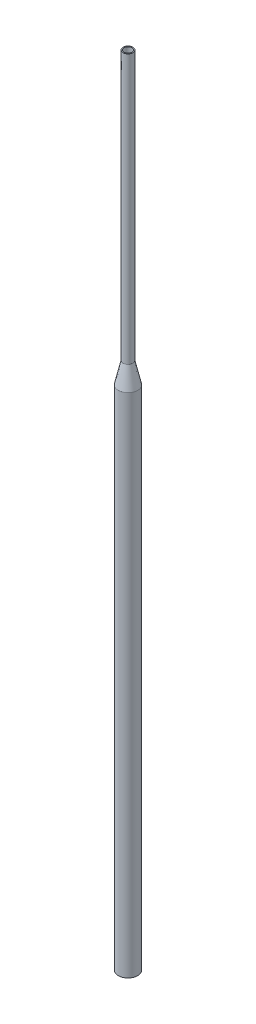
ISO-10303-21;
HEADER;
FILE_DESCRIPTION(('STEP AP214'),'2;1');
FILE_NAME('part.step','',(''),(''),'','','');
FILE_SCHEMA(('AUTOMOTIVE_DESIGN { 1 0 10303 214 1 1 1 1 }'));
ENDSEC;
DATA;
#1=APPLICATION_CONTEXT('core data for automotive mechanical design processes');
#2=APPLICATION_PROTOCOL_DEFINITION('international standard','automotive_design',2000,#1);
#3=PRODUCT_CONTEXT('',#1,'mechanical');
#4=PRODUCT('Part','Part','',(#3));
#5=PRODUCT_RELATED_PRODUCT_CATEGORY('part','',(#4));
#6=PRODUCT_DEFINITION_FORMATION('','',#4);
#7=PRODUCT_DEFINITION_CONTEXT('part definition',#1,'design');
#8=PRODUCT_DEFINITION('design','',#6,#7);
#9=PRODUCT_DEFINITION_SHAPE('','',#8);
#10=(LENGTH_UNIT() NAMED_UNIT(*) SI_UNIT(.MILLI.,.METRE.));
#11=(NAMED_UNIT(*) PLANE_ANGLE_UNIT() SI_UNIT($,.RADIAN.));
#12=(NAMED_UNIT(*) SI_UNIT($,.STERADIAN.) SOLID_ANGLE_UNIT());
#13=UNCERTAINTY_MEASURE_WITH_UNIT(LENGTH_MEASURE(1.E-05),#10,'distance_accuracy_value','');
#14=(GEOMETRIC_REPRESENTATION_CONTEXT(3) GLOBAL_UNCERTAINTY_ASSIGNED_CONTEXT((#13)) GLOBAL_UNIT_ASSIGNED_CONTEXT((#10,
#11,#12)) REPRESENTATION_CONTEXT('',''));
#15=CARTESIAN_POINT('',(0.,0.,0.));
#16=DIRECTION('',(0.,0.,1.));
#17=DIRECTION('',(1.,0.,0.));
#18=AXIS2_PLACEMENT_3D('',#15,#16,#17);
#19=CARTESIAN_POINT('',(0.,820.,0.));
#20=DIRECTION('',(0.,-1.,0.));
#21=DIRECTION('',(0.,0.,-1.));
#22=AXIS2_PLACEMENT_3D('',#19,#20,#21);
#23=CYLINDRICAL_SURFACE('',#22,5.);
#24=CARTESIAN_POINT('',(0.,543.314758742843,0.));
#25=DIRECTION('',(0.,1.,0.));
#26=DIRECTION('',(0.,0.,1.));
#27=AXIS2_PLACEMENT_3D('',#24,#25,#26);
#28=CIRCLE('',#27,5.);
#29=CARTESIAN_POINT('',(0.,543.314758742843,-5.00000000000001));
#30=VERTEX_POINT('',#29);
#31=EDGE_CURVE('E38',#30,#30,#28,.T.);
#32=ORIENTED_EDGE('',*,*,#31,.T.);
#33=EDGE_LOOP('',(#32));
#34=FACE_BOUND('',#33,.T.);
#35=CARTESIAN_POINT('',(0.,820.,0.));
#36=DIRECTION('',(0.,1.,0.));
#37=DIRECTION('',(0.,0.,1.));
#38=AXIS2_PLACEMENT_3D('',#35,#36,#37);
#39=CIRCLE('',#38,5.);
#40=CARTESIAN_POINT('',(0.,820.,5.));
#41=VERTEX_POINT('',#40);
#42=EDGE_CURVE('E42',#41,#41,#39,.T.);
#43=ORIENTED_EDGE('',*,*,#42,.F.);
#44=EDGE_LOOP('',(#43));
#45=FACE_BOUND('',#44,.T.);
#46=ADVANCED_FACE('F31',(#34,#45),#23,.T.);
#47=CARTESIAN_POINT('',(0.,820.,0.));
#48=DIRECTION('',(0.,1.,0.));
#49=DIRECTION('',(0.,0.,1.));
#50=AXIS2_PLACEMENT_3D('',#47,#48,#49);
#51=PLANE('',#50);
#52=CARTESIAN_POINT('',(0.,820.,0.));
#53=DIRECTION('',(0.,1.,0.));
#54=DIRECTION('',(0.,0.,1.));
#55=AXIS2_PLACEMENT_3D('',#52,#53,#54);
#56=CIRCLE('',#55,4.);
#57=CARTESIAN_POINT('',(0.,820.,4.));
#58=VERTEX_POINT('',#57);
#59=EDGE_CURVE('E52',#58,#58,#56,.T.);
#60=ORIENTED_EDGE('',*,*,#59,.F.);
#61=EDGE_LOOP('',(#60));
#62=FACE_BOUND('',#61,.T.);
#63=ORIENTED_EDGE('',*,*,#42,.T.);
#64=EDGE_LOOP('',(#63));
#65=FACE_BOUND('',#64,.T.);
#66=ADVANCED_FACE('F67',(#62,#65),#51,.T.);
#67=CARTESIAN_POINT('',(0.,500.,0.));
#68=DIRECTION('',(0.,-1.,0.));
#69=DIRECTION('',(0.,0.,-1.));
#70=AXIS2_PLACEMENT_3D('',#67,#68,#69);
#71=CYLINDRICAL_SURFACE('',#70,10.);
#72=CARTESIAN_POINT('',(0.,521.657379371422,0.));
#73=DIRECTION('',(0.,-1.,0.));
#74=DIRECTION('',(0.,0.,-1.));
#75=AXIS2_PLACEMENT_3D('',#72,#73,#74);
#76=CIRCLE('',#75,10.);
#77=CARTESIAN_POINT('',(0.,521.657379371422,-9.99999999999998));
#78=VERTEX_POINT('',#77);
#79=EDGE_CURVE('E10',#78,#78,#76,.T.);
#80=ORIENTED_EDGE('',*,*,#79,.T.);
#81=EDGE_LOOP('',(#80));
#82=FACE_BOUND('',#81,.T.);
#83=CARTESIAN_POINT('',(0.,0.,0.));
#84=DIRECTION('',(0.,1.,0.));
#85=DIRECTION('',(0.,0.,1.));
#86=AXIS2_PLACEMENT_3D('',#83,#84,#85);
#87=CIRCLE('',#86,10.);
#88=CARTESIAN_POINT('',(0.,0.,10.));
#89=VERTEX_POINT('',#88);
#90=EDGE_CURVE('E46',#89,#89,#87,.T.);
#91=ORIENTED_EDGE('',*,*,#90,.T.);
#92=EDGE_LOOP('',(#91));
#93=FACE_BOUND('',#92,.T.);
#94=ADVANCED_FACE('F70',(#82,#93),#71,.T.);
#95=CARTESIAN_POINT('',(0.,0.,0.));
#96=DIRECTION('',(0.,1.,0.));
#97=DIRECTION('',(0.,0.,1.));
#98=AXIS2_PLACEMENT_3D('',#95,#96,#97);
#99=PLANE('',#98);
#100=CARTESIAN_POINT('',(0.,0.,0.));
#101=DIRECTION('',(0.,1.,0.));
#102=DIRECTION('',(0.,0.,1.));
#103=AXIS2_PLACEMENT_3D('',#100,#101,#102);
#104=CIRCLE('',#103,4.);
#105=CARTESIAN_POINT('',(0.,0.,4.));
#106=VERTEX_POINT('',#105);
#107=EDGE_CURVE('E51',#106,#106,#104,.T.);
#108=ORIENTED_EDGE('',*,*,#107,.T.);
#109=EDGE_LOOP('',(#108));
#110=FACE_BOUND('',#109,.T.);
#111=ORIENTED_EDGE('',*,*,#90,.F.);
#112=EDGE_LOOP('',(#111));
#113=FACE_BOUND('',#112,.T.);
#114=ADVANCED_FACE('F58',(#110,#113),#99,.F.);
#115=CARTESIAN_POINT('',(0.,543.314758742843,0.));
#116=DIRECTION('',(0.,-1.,0.));
#117=DIRECTION('',(0.,0.,-1.));
#118=AXIS2_PLACEMENT_3D('',#115,#116,#117);
#119=CONICAL_SURFACE('',#118,5.,0.226892802759261);
#120=CARTESIAN_POINT('',(0.,521.657379371422,-9.99999999999998));
#121=CARTESIAN_POINT('',(0.,521.882977073208,-9.94791666666664));
#122=CARTESIAN_POINT('',(0.,522.108574774994,-9.89583333333331));
#123=CARTESIAN_POINT('',(0.,522.559770178565,-9.79166666666665));
#124=CARTESIAN_POINT('',(0.,522.785367880351,-9.73958333333332));
#125=CARTESIAN_POINT('',(0.,523.236563283922,-9.63541666666666));
#126=CARTESIAN_POINT('',(0.,523.462160985707,-9.58333333333332));
#127=CARTESIAN_POINT('',(0.,523.913356389279,-9.47916666666665));
#128=CARTESIAN_POINT('',(0.,524.138954091064,-9.42708333333333));
#129=CARTESIAN_POINT('',(0.,524.590149494636,-9.32291666666666));
#130=CARTESIAN_POINT('',(0.,524.815747196421,-9.27083333333332));
#131=CARTESIAN_POINT('',(0.,525.266942599992,-9.16666666666665));
#132=CARTESIAN_POINT('',(0.,525.492540301778,-9.11458333333333));
#133=CARTESIAN_POINT('',(0.,525.943735705349,-9.01041666666666));
#134=CARTESIAN_POINT('',(0.,526.169333407135,-8.95833333333332));
#135=CARTESIAN_POINT('',(0.,526.620528810706,-8.85416666666665));
#136=CARTESIAN_POINT('',(0.,526.846126512492,-8.80208333333333));
#137=CARTESIAN_POINT('',(0.,527.297321916063,-8.69791666666666));
#138=CARTESIAN_POINT('',(0.,527.522919617849,-8.64583333333332));
#139=CARTESIAN_POINT('',(0.,527.97411502142,-8.54166666666666));
#140=CARTESIAN_POINT('',(0.,528.199712723206,-8.48958333333333));
#141=CARTESIAN_POINT('',(0.,528.650908126777,-8.38541666666666));
#142=CARTESIAN_POINT('',(0.,528.876505828563,-8.33333333333332));
#143=CARTESIAN_POINT('',(0.,529.327701232134,-8.22916666666666));
#144=CARTESIAN_POINT('',(0.,529.55329893392,-8.17708333333333));
#145=CARTESIAN_POINT('',(0.,530.004494337491,-8.07291666666667));
#146=CARTESIAN_POINT('',(0.,530.230092039276,-8.02083333333333));
#147=CARTESIAN_POINT('',(0.,530.681287442848,-7.91666666666666));
#148=CARTESIAN_POINT('',(0.,530.906885144633,-7.86458333333333));
#149=CARTESIAN_POINT('',(0.,531.358080548205,-7.76041666666667));
#150=CARTESIAN_POINT('',(0.,531.58367824999,-7.70833333333333));
#151=CARTESIAN_POINT('',(0.,532.034873653561,-7.60416666666666));
#152=CARTESIAN_POINT('',(0.,532.260471355347,-7.55208333333333));
#153=CARTESIAN_POINT('',(0.,532.711666758918,-7.44791666666667));
#154=CARTESIAN_POINT('',(0.,532.937264460704,-7.39583333333334));
#155=CARTESIAN_POINT('',(0.,533.388459864275,-7.29166666666667));
#156=CARTESIAN_POINT('',(0.,533.614057566061,-7.23958333333333));
#157=CARTESIAN_POINT('',(0.,534.065252969632,-7.13541666666666));
#158=CARTESIAN_POINT('',(0.,534.290850671418,-7.08333333333334));
#159=CARTESIAN_POINT('',(0.,534.742046074989,-6.97916666666667));
#160=CARTESIAN_POINT('',(0.,534.967643776775,-6.92708333333333));
#161=CARTESIAN_POINT('',(0.,535.418839180346,-6.82291666666666));
#162=CARTESIAN_POINT('',(0.,535.644436882132,-6.77083333333334));
#163=CARTESIAN_POINT('',(0.,536.095632285703,-6.66666666666667));
#164=CARTESIAN_POINT('',(0.,536.321229987489,-6.61458333333333));
#165=CARTESIAN_POINT('',(0.,536.77242539106,-6.51041666666667));
#166=CARTESIAN_POINT('',(0.,536.998023092846,-6.45833333333334));
#167=CARTESIAN_POINT('',(0.,537.449218496417,-6.35416666666668));
#168=CARTESIAN_POINT('',(0.,537.674816198202,-6.30208333333333));
#169=CARTESIAN_POINT('',(0.,538.126011601774,-6.19791666666667));
#170=CARTESIAN_POINT('',(0.,538.351609303559,-6.14583333333334));
#171=CARTESIAN_POINT('',(0.,538.802804707131,-6.04166666666668));
#172=CARTESIAN_POINT('',(0.,539.028402408916,-5.98958333333334));
#173=CARTESIAN_POINT('',(0.,539.479597812487,-5.88541666666667));
#174=CARTESIAN_POINT('',(0.,539.705195514273,-5.83333333333334));
#175=CARTESIAN_POINT('',(0.,540.156390917844,-5.72916666666668));
#176=CARTESIAN_POINT('',(0.,540.38198861963,-5.67708333333334));
#177=CARTESIAN_POINT('',(0.,540.833184023201,-5.57291666666667));
#178=CARTESIAN_POINT('',(0.,541.058781724987,-5.52083333333335));
#179=CARTESIAN_POINT('',(0.,541.509977128558,-5.41666666666668));
#180=CARTESIAN_POINT('',(0.,541.735574830344,-5.36458333333334));
#181=CARTESIAN_POINT('',(0.,542.186770233915,-5.26041666666667));
#182=CARTESIAN_POINT('',(0.,542.412367935701,-5.20833333333334));
#183=CARTESIAN_POINT('',(0.,542.863563339272,-5.10416666666668));
#184=CARTESIAN_POINT('',(0.,543.089161041058,-5.05208333333335));
#185=CARTESIAN_POINT('',(0.,543.314758742843,-5.00000000000001));
#186=B_SPLINE_CURVE_WITH_KNOTS('',3,(#120,#121,#122,#123,#124,#125,#126,#127,#128,#129,#130,
#131,#132,#133,#134,#135,#136,#137,#138,#139,#140,#141,#142,#143,#144,#145,#146,#147,#148,#149,
#150,#151,#152,#153,#154,#155,#156,#157,#158,#159,#160,#161,#162,#163,#164,#165,#166,#167,#168,
#169,#170,#171,#172,#173,#174,#175,#176,#177,#178,#179,#180,#181,#182,#183,#184,#185),
.UNSPECIFIED.,.F.,.F.,(4,2,2,2,2,2,2,2,2,2,2,2,2,2,2,2,2,2,2,2,2,2,2,2,2,2,2,2,2,2,2,2,4),(0.,
0.694595544153977,1.38919108830806,2.08378663246204,2.77838217661612,3.4729777207701,
4.16757326492418,4.86216880907816,5.55676435323225,6.25135989738622,6.94595544154031,
7.64055098569428,8.33514652984837,9.02974207400234,9.72433761815643,10.4189331623104,
11.1135287064645,11.8081242506186,12.5027197947725,13.1973153389266,13.8919108830806,
14.5865064272347,15.2811019713887,15.9756975155428,16.6702930596967,17.3648886038508,
18.0594841480048,18.7540796921589,19.4486752363129,20.1432707804669,20.8378663246209,
21.532461868775,22.2270574129291),.UNSPECIFIED.);
#187=EDGE_CURVE('BSEAM33',#78,#30,#186,.T.);
#188=ORIENTED_EDGE('',*,*,#79,.F.);
#189=ORIENTED_EDGE('',*,*,#31,.F.);
#190=ORIENTED_EDGE('',*,*,#187,.T.);
#191=ORIENTED_EDGE('',*,*,#187,.F.);
#192=EDGE_LOOP('',(#188,#190,#189,#191));
#193=FACE_BOUND('',#192,.T.);
#194=ADVANCED_FACE('F33',(#193),#119,.T.);
#195=CARTESIAN_POINT('',(0.,0.,0.));
#196=DIRECTION('',(0.,1.,0.));
#197=DIRECTION('',(0.,0.,1.));
#198=AXIS2_PLACEMENT_3D('',#195,#196,#197);
#199=CYLINDRICAL_SURFACE('',#198,4.);
#200=ORIENTED_EDGE('',*,*,#107,.F.);
#201=EDGE_LOOP('',(#200));
#202=FACE_BOUND('',#201,.T.);
#203=ORIENTED_EDGE('',*,*,#59,.T.);
#204=EDGE_LOOP('',(#203));
#205=FACE_BOUND('',#204,.T.);
#206=ADVANCED_FACE('F61',(#202,#205),#199,.F.);
#207=CLOSED_SHELL('',(#46,#66,#94,#114,#194,#206));
#208=MANIFOLD_SOLID_BREP('B2',#207);
#209=ADVANCED_BREP_SHAPE_REPRESENTATION('',(#18,#208),#14);
#210=SHAPE_DEFINITION_REPRESENTATION(#9,#209);
ENDSEC;
END-ISO-10303-21;
